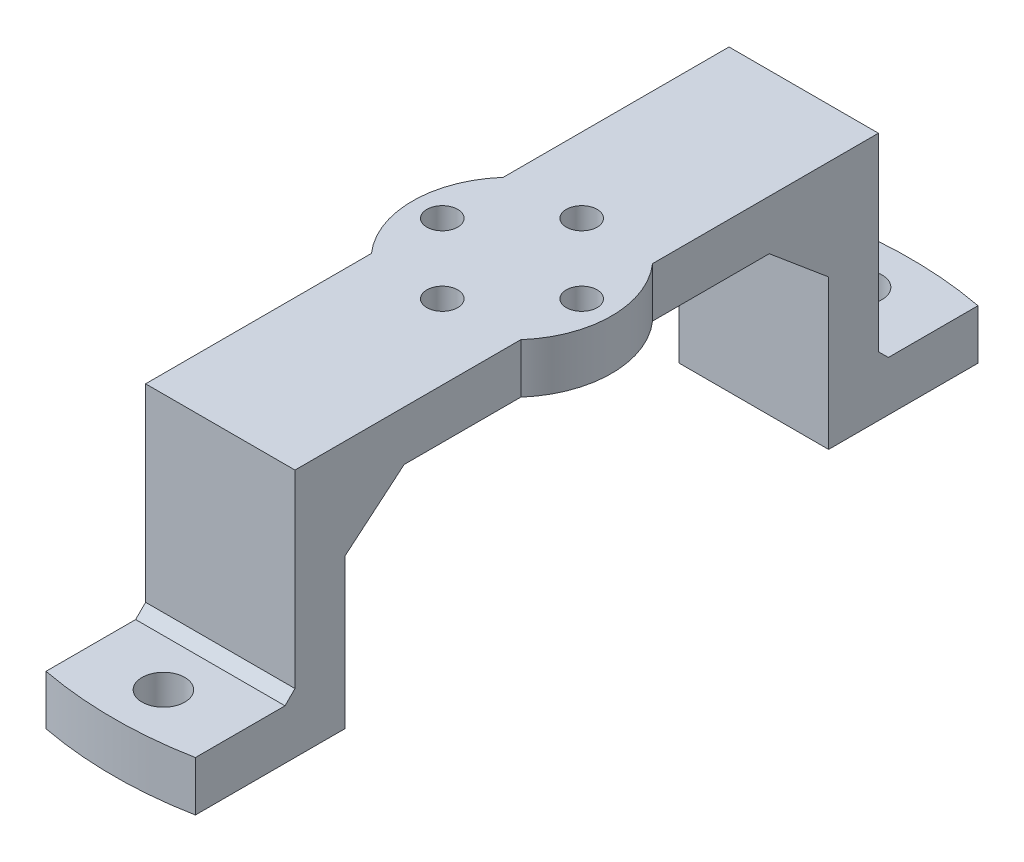
ISO-10303-21;
HEADER;
FILE_DESCRIPTION(('STEP AP214'),'2;1');
FILE_NAME('part.step','',(''),(''),'','','');
FILE_SCHEMA(('AUTOMOTIVE_DESIGN { 1 0 10303 214 1 1 1 1 }'));
ENDSEC;
DATA;
#1=APPLICATION_CONTEXT('core data for automotive mechanical design processes');
#2=APPLICATION_PROTOCOL_DEFINITION('international standard','automotive_design',2000,#1);
#3=PRODUCT_CONTEXT('',#1,'mechanical');
#4=PRODUCT('Part','Part','',(#3));
#5=PRODUCT_RELATED_PRODUCT_CATEGORY('part','',(#4));
#6=PRODUCT_DEFINITION_FORMATION('','',#4);
#7=PRODUCT_DEFINITION_CONTEXT('part definition',#1,'design');
#8=PRODUCT_DEFINITION('design','',#6,#7);
#9=PRODUCT_DEFINITION_SHAPE('','',#8);
#10=(LENGTH_UNIT() NAMED_UNIT(*) SI_UNIT(.MILLI.,.METRE.));
#11=(NAMED_UNIT(*) PLANE_ANGLE_UNIT() SI_UNIT($,.RADIAN.));
#12=(NAMED_UNIT(*) SI_UNIT($,.STERADIAN.) SOLID_ANGLE_UNIT());
#13=UNCERTAINTY_MEASURE_WITH_UNIT(LENGTH_MEASURE(1.E-05),#10,'distance_accuracy_value','');
#14=(GEOMETRIC_REPRESENTATION_CONTEXT(3) GLOBAL_UNCERTAINTY_ASSIGNED_CONTEXT((#13)) GLOBAL_UNIT_ASSIGNED_CONTEXT((#10,
#11,#12)) REPRESENTATION_CONTEXT('',''));
#15=CARTESIAN_POINT('',(0.,0.,0.));
#16=DIRECTION('',(0.,0.,1.));
#17=DIRECTION('',(1.,0.,0.));
#18=AXIS2_PLACEMENT_3D('',#15,#16,#17);
#19=CARTESIAN_POINT('',(7.5,5.,-39.2905841137543));
#20=DIRECTION('',(-1.,0.,0.));
#21=DIRECTION('',(0.,0.,1.));
#22=AXIS2_PLACEMENT_3D('',#19,#20,#21);
#23=PLANE('',#22);
#24=DIRECTION('',(0.,-1.,0.));
#25=VECTOR('',#24,1.);
#26=CARTESIAN_POINT('',(7.5,5.,24.2905841137543));
#27=LINE('',#26,#25);
#28=CARTESIAN_POINT('',(7.5,15.,24.2905841137543));
#29=VERTEX_POINT('',#28);
#30=CARTESIAN_POINT('',(7.5,0.,24.2905841137543));
#31=VERTEX_POINT('',#30);
#32=EDGE_CURVE('E265',#29,#31,#27,.T.);
#33=ORIENTED_EDGE('',*,*,#32,.F.);
#34=DIRECTION('',(0.,0.642787609686536,-0.766044443118981));
#35=VECTOR('',#34,1.);
#36=CARTESIAN_POINT('',(7.5,42.1758545963466,-8.09633823325997));
#37=LINE('',#36,#35);
#38=CARTESIAN_POINT('',(7.5,20.,18.3318161507832));
#39=VERTEX_POINT('',#38);
#40=EDGE_CURVE('E181',#29,#39,#37,.T.);
#41=ORIENTED_EDGE('',*,*,#40,.T.);
#42=DIRECTION('',(0.,0.,-1.));
#43=VECTOR('',#42,1.);
#44=CARTESIAN_POINT('',(7.5,20.,29.2905841137543));
#45=LINE('',#44,#43);
#46=CARTESIAN_POINT('',(7.5,20.,6.61437827766148));
#47=VERTEX_POINT('',#46);
#48=EDGE_CURVE('E174',#39,#47,#45,.T.);
#49=ORIENTED_EDGE('',*,*,#48,.T.);
#50=DIRECTION('',(0.,1.,0.));
#51=VECTOR('',#50,1.);
#52=CARTESIAN_POINT('',(7.5,20.,6.61437827766148));
#53=LINE('',#52,#51);
#54=CARTESIAN_POINT('',(7.5,25.,6.61437827766148));
#55=VERTEX_POINT('',#54);
#56=EDGE_CURVE('E178',#47,#55,#53,.T.);
#57=ORIENTED_EDGE('',*,*,#56,.T.);
#58=DIRECTION('',(0.,0.,-1.));
#59=VECTOR('',#58,1.);
#60=CARTESIAN_POINT('',(7.5,25.,29.2905841137543));
#61=LINE('',#60,#59);
#62=CARTESIAN_POINT('',(7.5,25.,29.2905841137543));
#63=VERTEX_POINT('',#62);
#64=EDGE_CURVE('E281',#63,#55,#61,.T.);
#65=ORIENTED_EDGE('',*,*,#64,.F.);
#66=DIRECTION('',(0.,-1.,0.));
#67=VECTOR('',#66,1.);
#68=CARTESIAN_POINT('',(7.5,25.,29.2905841137543));
#69=LINE('',#68,#67);
#70=CARTESIAN_POINT('',(7.5,6.00000000000002,29.2905841137543));
#71=VERTEX_POINT('',#70);
#72=EDGE_CURVE('E288',#63,#71,#69,.T.);
#73=ORIENTED_EDGE('',*,*,#72,.T.);
#74=DIRECTION('',(0.,-0.707106781186553,0.707106781186542));
#75=VECTOR('',#74,1.);
#76=CARTESIAN_POINT('',(7.5,39.7905841137543,-4.49999999999949));
#77=LINE('',#76,#75);
#78=CARTESIAN_POINT('',(7.5,5.,30.2905841137543));
#79=VERTEX_POINT('',#78);
#80=EDGE_CURVE('E48',#71,#79,#77,.T.);
#81=ORIENTED_EDGE('',*,*,#80,.T.);
#82=DIRECTION('',(0.,0.,-1.));
#83=VECTOR('',#82,1.);
#84=CARTESIAN_POINT('',(7.5,5.,24.2905841137543));
#85=LINE('',#84,#83);
#86=CARTESIAN_POINT('',(7.5,5.,39.2905841137543));
#87=VERTEX_POINT('',#86);
#88=EDGE_CURVE('E238',#87,#79,#85,.T.);
#89=ORIENTED_EDGE('',*,*,#88,.F.);
#90=DIRECTION('',(0.,-1.,0.));
#91=VECTOR('',#90,1.);
#92=CARTESIAN_POINT('',(7.5,5.,39.2905841137543));
#93=LINE('',#92,#91);
#94=CARTESIAN_POINT('',(7.5,0.,39.2905841137543));
#95=VERTEX_POINT('',#94);
#96=EDGE_CURVE('E268',#87,#95,#93,.T.);
#97=ORIENTED_EDGE('',*,*,#96,.T.);
#98=DIRECTION('',(0.,0.,-1.));
#99=VECTOR('',#98,1.);
#100=CARTESIAN_POINT('',(7.5,0.,24.2905841137543));
#101=LINE('',#100,#99);
#102=EDGE_CURVE('E249',#95,#31,#101,.T.);
#103=ORIENTED_EDGE('',*,*,#102,.T.);
#104=EDGE_LOOP('',(#33,#41,#49,#57,#65,#73,#81,#89,#97,#103));
#105=FACE_BOUND('',#104,.T.);
#106=ADVANCED_FACE('F39',(#105),#23,.F.);
#107=CARTESIAN_POINT('',(-7.5,5.,-39.2905841137543));
#108=DIRECTION('',(1.,0.,0.));
#109=DIRECTION('',(0.,0.,-1.));
#110=AXIS2_PLACEMENT_3D('',#107,#108,#109);
#111=PLANE('',#110);
#112=DIRECTION('',(0.,-1.,0.));
#113=VECTOR('',#112,1.);
#114=CARTESIAN_POINT('',(-7.5,5.,-24.2905841137543));
#115=LINE('',#114,#113);
#116=CARTESIAN_POINT('',(-7.5,15.,-24.2905841137543));
#117=VERTEX_POINT('',#116);
#118=CARTESIAN_POINT('',(-7.5,0.,-24.2905841137543));
#119=VERTEX_POINT('',#118);
#120=EDGE_CURVE('E326',#117,#119,#115,.T.);
#121=ORIENTED_EDGE('',*,*,#120,.F.);
#122=DIRECTION('',(0.,0.642787609686536,0.766044443118981));
#123=VECTOR('',#122,1.);
#124=CARTESIAN_POINT('',(-7.5,3.48218274074315,-38.0169842113174));
#125=LINE('',#124,#123);
#126=CARTESIAN_POINT('',(-7.5,20.,-18.3318161507832));
#127=VERTEX_POINT('',#126);
#128=EDGE_CURVE('E367',#117,#127,#125,.T.);
#129=ORIENTED_EDGE('',*,*,#128,.T.);
#130=DIRECTION('',(0.,0.,1.));
#131=VECTOR('',#130,1.);
#132=CARTESIAN_POINT('',(-7.5,20.,29.2905841137543));
#133=LINE('',#132,#131);
#134=CARTESIAN_POINT('',(-7.5,20.,-6.61437827766147));
#135=VERTEX_POINT('',#134);
#136=EDGE_CURVE('E289',#127,#135,#133,.T.);
#137=ORIENTED_EDGE('',*,*,#136,.T.);
#138=DIRECTION('',(0.,1.,0.));
#139=VECTOR('',#138,1.);
#140=CARTESIAN_POINT('',(-7.5,20.,-6.61437827766147));
#141=LINE('',#140,#139);
#142=CARTESIAN_POINT('',(-7.5,25.,-6.61437827766148));
#143=VERTEX_POINT('',#142);
#144=EDGE_CURVE('E212',#135,#143,#141,.T.);
#145=ORIENTED_EDGE('',*,*,#144,.T.);
#146=DIRECTION('',(0.,0.,1.));
#147=VECTOR('',#146,1.);
#148=CARTESIAN_POINT('',(-7.5,25.,29.2905841137543));
#149=LINE('',#148,#147);
#150=CARTESIAN_POINT('',(-7.5,25.,-29.2905841137543));
#151=VERTEX_POINT('',#150);
#152=EDGE_CURVE('E273',#151,#143,#149,.T.);
#153=ORIENTED_EDGE('',*,*,#152,.F.);
#154=DIRECTION('',(0.,-1.,0.));
#155=VECTOR('',#154,1.);
#156=CARTESIAN_POINT('',(-7.5,20.,-29.2905841137543));
#157=LINE('',#156,#155);
#158=CARTESIAN_POINT('',(-7.5,6.00000000000002,-29.2905841137543));
#159=VERTEX_POINT('',#158);
#160=EDGE_CURVE('E298',#151,#159,#157,.T.);
#161=ORIENTED_EDGE('',*,*,#160,.T.);
#162=DIRECTION('',(0.,-0.707106781186553,-0.707106781186542));
#163=VECTOR('',#162,1.);
#164=CARTESIAN_POINT('',(-7.5,0.499999999999998,-34.7905841137542));
#165=LINE('',#164,#163);
#166=CARTESIAN_POINT('',(-7.5,5.,-30.2905841137543));
#167=VERTEX_POINT('',#166);
#168=EDGE_CURVE('E388',#159,#167,#165,.T.);
#169=ORIENTED_EDGE('',*,*,#168,.T.);
#170=DIRECTION('',(0.,0.,1.));
#171=VECTOR('',#170,1.);
#172=CARTESIAN_POINT('',(-7.5,5.,-39.2905841137543));
#173=LINE('',#172,#171);
#174=CARTESIAN_POINT('',(-7.49999999999998,5.,-39.2905841137543));
#175=VERTEX_POINT('',#174);
#176=EDGE_CURVE('E322',#175,#167,#173,.T.);
#177=ORIENTED_EDGE('',*,*,#176,.F.);
#178=DIRECTION('',(0.,-1.,0.));
#179=VECTOR('',#178,1.);
#180=CARTESIAN_POINT('',(-7.49999999999998,5.,-39.2905841137543));
#181=LINE('',#180,#179);
#182=CARTESIAN_POINT('',(-7.49999999999998,0.,-39.2905841137543));
#183=VERTEX_POINT('',#182);
#184=EDGE_CURVE('E341',#175,#183,#181,.T.);
#185=ORIENTED_EDGE('',*,*,#184,.T.);
#186=DIRECTION('',(0.,0.,1.));
#187=VECTOR('',#186,1.);
#188=CARTESIAN_POINT('',(-7.5,0.,-39.2905841137543));
#189=LINE('',#188,#187);
#190=EDGE_CURVE('E319',#183,#119,#189,.T.);
#191=ORIENTED_EDGE('',*,*,#190,.T.);
#192=EDGE_LOOP('',(#121,#129,#137,#145,#153,#161,#169,#177,#185,#191));
#193=FACE_BOUND('',#192,.T.);
#194=ADVANCED_FACE('F442',(#193),#111,.F.);
#195=CARTESIAN_POINT('',(0.,20.,0.));
#196=DIRECTION('',(0.,-1.,0.));
#197=DIRECTION('',(0.,0.,-1.));
#198=AXIS2_PLACEMENT_3D('',#195,#196,#197);
#199=PLANE('',#198);
#200=CARTESIAN_POINT('',(0.,20.,-7.));
#201=DIRECTION('',(0.,1.,0.));
#202=DIRECTION('',(0.,0.,1.));
#203=AXIS2_PLACEMENT_3D('',#200,#201,#202);
#204=CIRCLE('',#203,1.55);
#205=CARTESIAN_POINT('',(0.,20.,-5.45));
#206=VERTEX_POINT('',#205);
#207=EDGE_CURVE('E438',#206,#206,#204,.T.);
#208=ORIENTED_EDGE('',*,*,#207,.T.);
#209=EDGE_LOOP('',(#208));
#210=FACE_BOUND('',#209,.T.);
#211=CARTESIAN_POINT('',(7.,20.,0.));
#212=DIRECTION('',(0.,1.,0.));
#213=DIRECTION('',(0.,0.,1.));
#214=AXIS2_PLACEMENT_3D('',#211,#212,#213);
#215=CIRCLE('',#214,1.55);
#216=CARTESIAN_POINT('',(7.,20.,1.55));
#217=VERTEX_POINT('',#216);
#218=EDGE_CURVE('E802',#217,#217,#215,.T.);
#219=ORIENTED_EDGE('',*,*,#218,.T.);
#220=EDGE_LOOP('',(#219));
#221=FACE_BOUND('',#220,.T.);
#222=CARTESIAN_POINT('',(0.,20.,7.));
#223=DIRECTION('',(0.,1.,0.));
#224=DIRECTION('',(0.,0.,1.));
#225=AXIS2_PLACEMENT_3D('',#222,#223,#224);
#226=CIRCLE('',#225,1.55);
#227=CARTESIAN_POINT('',(0.,20.,8.55));
#228=VERTEX_POINT('',#227);
#229=EDGE_CURVE('E794',#228,#228,#226,.T.);
#230=ORIENTED_EDGE('',*,*,#229,.T.);
#231=EDGE_LOOP('',(#230));
#232=FACE_BOUND('',#231,.T.);
#233=CARTESIAN_POINT('',(-7.,20.,0.));
#234=DIRECTION('',(0.,1.,0.));
#235=DIRECTION('',(0.,0.,1.));
#236=AXIS2_PLACEMENT_3D('',#233,#234,#235);
#237=CIRCLE('',#236,1.55);
#238=CARTESIAN_POINT('',(-7.,20.,1.55));
#239=VERTEX_POINT('',#238);
#240=EDGE_CURVE('E788',#239,#239,#237,.T.);
#241=ORIENTED_EDGE('',*,*,#240,.T.);
#242=EDGE_LOOP('',(#241));
#243=FACE_BOUND('',#242,.T.);
#244=ORIENTED_EDGE('',*,*,#136,.F.);
#245=DIRECTION('',(1.,0.,0.));
#246=VECTOR('',#245,1.);
#247=CARTESIAN_POINT('',(0.,20.,-18.3318161507832));
#248=LINE('',#247,#246);
#249=CARTESIAN_POINT('',(7.5,20.,-18.3318161507832));
#250=VERTEX_POINT('',#249);
#251=EDGE_CURVE('E355',#127,#250,#248,.T.);
#252=ORIENTED_EDGE('',*,*,#251,.T.);
#253=CARTESIAN_POINT('',(7.5,20.,-6.61437827766148));
#254=VERTEX_POINT('',#253);
#255=EDGE_CURVE('E188',#254,#250,#45,.T.);
#256=ORIENTED_EDGE('',*,*,#255,.F.);
#257=CARTESIAN_POINT('',(0.,20.,0.));
#258=DIRECTION('',(0.,1.,0.));
#259=DIRECTION('',(0.,0.,1.));
#260=AXIS2_PLACEMENT_3D('',#257,#258,#259);
#261=CIRCLE('',#260,10.);
#262=EDGE_CURVE('E193',#47,#254,#261,.T.);
#263=ORIENTED_EDGE('',*,*,#262,.F.);
#264=ORIENTED_EDGE('',*,*,#48,.F.);
#265=DIRECTION('',(-1.,0.,0.));
#266=VECTOR('',#265,1.);
#267=CARTESIAN_POINT('',(0.,20.,18.3318161507832));
#268=LINE('',#267,#266);
#269=CARTESIAN_POINT('',(-7.5,20.,18.3318161507832));
#270=VERTEX_POINT('',#269);
#271=EDGE_CURVE('E352',#39,#270,#268,.T.);
#272=ORIENTED_EDGE('',*,*,#271,.T.);
#273=CARTESIAN_POINT('',(-7.5,20.,6.61437827766147));
#274=VERTEX_POINT('',#273);
#275=EDGE_CURVE('E272',#274,#270,#133,.T.);
#276=ORIENTED_EDGE('',*,*,#275,.F.);
#277=EDGE_CURVE('E207',#135,#274,#261,.T.);
#278=ORIENTED_EDGE('',*,*,#277,.F.);
#279=EDGE_LOOP('',(#244,#252,#256,#263,#264,#272,#276,#278));
#280=FACE_BOUND('',#279,.T.);
#281=ADVANCED_FACE('F202',(#210,#221,#232,#243,#280),#199,.T.);
#282=CARTESIAN_POINT('',(0.,5.,0.));
#283=DIRECTION('',(0.,1.,0.));
#284=DIRECTION('',(0.,0.,1.));
#285=AXIS2_PLACEMENT_3D('',#282,#283,#284);
#286=PLANE('',#285);
#287=ORIENTED_EDGE('',*,*,#176,.T.);
#288=DIRECTION('',(1.,0.,0.));
#289=VECTOR('',#288,1.);
#290=CARTESIAN_POINT('',(0.,5.,-30.2905841137543));
#291=LINE('',#290,#289);
#292=CARTESIAN_POINT('',(7.5,5.,-30.2905841137543));
#293=VERTEX_POINT('',#292);
#294=EDGE_CURVE('E379',#167,#293,#291,.T.);
#295=ORIENTED_EDGE('',*,*,#294,.T.);
#296=DIRECTION('',(0.,0.,-1.));
#297=VECTOR('',#296,1.);
#298=CARTESIAN_POINT('',(7.5,5.,-39.2905841137543));
#299=LINE('',#298,#297);
#300=CARTESIAN_POINT('',(7.5,5.,-39.2905841137543));
#301=VERTEX_POINT('',#300);
#302=EDGE_CURVE('E315',#293,#301,#299,.T.);
#303=ORIENTED_EDGE('',*,*,#302,.T.);
#304=CARTESIAN_POINT('',(0.,5.,0.));
#305=DIRECTION('',(0.,1.,0.));
#306=DIRECTION('',(0.,0.,1.));
#307=AXIS2_PLACEMENT_3D('',#304,#305,#306);
#308=CIRCLE('',#307,40.);
#309=EDGE_CURVE('E318',#301,#175,#308,.T.);
#310=ORIENTED_EDGE('',*,*,#309,.T.);
#311=EDGE_LOOP('',(#287,#295,#303,#310));
#312=FACE_BOUND('',#311,.T.);
#313=CARTESIAN_POINT('',(0.,5.,-35.));
#314=DIRECTION('',(0.,1.,0.));
#315=DIRECTION('',(0.,0.,1.));
#316=AXIS2_PLACEMENT_3D('',#313,#314,#315);
#317=CIRCLE('',#316,2.15);
#318=CARTESIAN_POINT('',(0.,5.,-32.85));
#319=VERTEX_POINT('',#318);
#320=EDGE_CURVE('E307',#319,#319,#317,.T.);
#321=ORIENTED_EDGE('',*,*,#320,.F.);
#322=EDGE_LOOP('',(#321));
#323=FACE_BOUND('',#322,.T.);
#324=ADVANCED_FACE('F469',(#312,#323),#286,.T.);
#325=CARTESIAN_POINT('',(0.,0.,0.));
#326=DIRECTION('',(0.,1.,0.));
#327=DIRECTION('',(0.,0.,1.));
#328=AXIS2_PLACEMENT_3D('',#325,#326,#327);
#329=PLANE('',#328);
#330=DIRECTION('',(1.,0.,0.));
#331=VECTOR('',#330,1.);
#332=CARTESIAN_POINT('',(-7.5,0.,-24.2905841137543));
#333=LINE('',#332,#331);
#334=CARTESIAN_POINT('',(7.5,0.,-24.2905841137543));
#335=VERTEX_POINT('',#334);
#336=EDGE_CURVE('E311',#119,#335,#333,.T.);
#337=ORIENTED_EDGE('',*,*,#336,.F.);
#338=ORIENTED_EDGE('',*,*,#190,.F.);
#339=CARTESIAN_POINT('',(0.,0.,0.));
#340=DIRECTION('',(0.,1.,0.));
#341=DIRECTION('',(0.,0.,1.));
#342=AXIS2_PLACEMENT_3D('',#339,#340,#341);
#343=CIRCLE('',#342,40.);
#344=CARTESIAN_POINT('',(7.5,0.,-39.2905841137543));
#345=VERTEX_POINT('',#344);
#346=EDGE_CURVE('E333',#345,#183,#343,.T.);
#347=ORIENTED_EDGE('',*,*,#346,.F.);
#348=DIRECTION('',(0.,0.,-1.));
#349=VECTOR('',#348,1.);
#350=CARTESIAN_POINT('',(7.5,0.,-39.2905841137543));
#351=LINE('',#350,#349);
#352=EDGE_CURVE('E330',#335,#345,#351,.T.);
#353=ORIENTED_EDGE('',*,*,#352,.F.);
#354=EDGE_LOOP('',(#337,#338,#347,#353));
#355=FACE_BOUND('',#354,.T.);
#356=CARTESIAN_POINT('',(0.,0.,-35.));
#357=DIRECTION('',(0.,1.,0.));
#358=DIRECTION('',(0.,0.,1.));
#359=AXIS2_PLACEMENT_3D('',#356,#357,#358);
#360=CIRCLE('',#359,2.15);
#361=CARTESIAN_POINT('',(0.,0.,-32.85));
#362=VERTEX_POINT('',#361);
#363=EDGE_CURVE('E306',#362,#362,#360,.T.);
#364=ORIENTED_EDGE('',*,*,#363,.T.);
#365=EDGE_LOOP('',(#364));
#366=FACE_BOUND('',#365,.T.);
#367=ADVANCED_FACE('F458',(#355,#366),#329,.F.);
#368=CARTESIAN_POINT('',(-7.5,5.,-24.2905841137543));
#369=DIRECTION('',(0.,0.,-1.));
#370=DIRECTION('',(-1.,0.,0.));
#371=AXIS2_PLACEMENT_3D('',#368,#369,#370);
#372=PLANE('',#371);
#373=DIRECTION('',(0.,-1.,0.));
#374=VECTOR('',#373,1.);
#375=CARTESIAN_POINT('',(7.5,5.,-24.2905841137543));
#376=LINE('',#375,#374);
#377=CARTESIAN_POINT('',(7.5,15.,-24.2905841137543));
#378=VERTEX_POINT('',#377);
#379=EDGE_CURVE('E349',#378,#335,#376,.T.);
#380=ORIENTED_EDGE('',*,*,#379,.F.);
#381=DIRECTION('',(-1.,0.,0.));
#382=VECTOR('',#381,1.);
#383=CARTESIAN_POINT('',(-7.5,15.,-24.2905841137543));
#384=LINE('',#383,#382);
#385=EDGE_CURVE('E358',#378,#117,#384,.T.);
#386=ORIENTED_EDGE('',*,*,#385,.T.);
#387=ORIENTED_EDGE('',*,*,#120,.T.);
#388=ORIENTED_EDGE('',*,*,#336,.T.);
#389=EDGE_LOOP('',(#380,#386,#387,#388));
#390=FACE_BOUND('',#389,.T.);
#391=ADVANCED_FACE('F454',(#390),#372,.F.);
#392=CARTESIAN_POINT('',(7.5,25.,-6.61437827766148));
#393=VERTEX_POINT('',#392);
#394=CARTESIAN_POINT('',(7.5,25.,-29.2905841137543));
#395=VERTEX_POINT('',#394);
#396=EDGE_CURVE('E280',#393,#395,#61,.T.);
#397=ORIENTED_EDGE('',*,*,#396,.F.);
#398=DIRECTION('',(0.,1.,0.));
#399=VECTOR('',#398,1.);
#400=CARTESIAN_POINT('',(7.5,20.,-6.61437827766148));
#401=LINE('',#400,#399);
#402=EDGE_CURVE('E198',#393,#254,#401,.F.);
#403=ORIENTED_EDGE('',*,*,#402,.T.);
#404=ORIENTED_EDGE('',*,*,#255,.T.);
#405=DIRECTION('',(0.,-0.642787609686536,-0.766044443118981));
#406=VECTOR('',#405,1.);
#407=CARTESIAN_POINT('',(7.5,3.48218274074315,-38.0169842113174));
#408=LINE('',#407,#406);
#409=EDGE_CURVE('E364',#250,#378,#408,.T.);
#410=ORIENTED_EDGE('',*,*,#409,.T.);
#411=ORIENTED_EDGE('',*,*,#379,.T.);
#412=ORIENTED_EDGE('',*,*,#352,.T.);
#413=DIRECTION('',(0.,-1.,0.));
#414=VECTOR('',#413,1.);
#415=CARTESIAN_POINT('',(7.5,5.,-39.2905841137543));
#416=LINE('',#415,#414);
#417=EDGE_CURVE('E345',#301,#345,#416,.T.);
#418=ORIENTED_EDGE('',*,*,#417,.F.);
#419=ORIENTED_EDGE('',*,*,#302,.F.);
#420=DIRECTION('',(0.,0.707106781186553,0.707106781186542));
#421=VECTOR('',#420,1.);
#422=CARTESIAN_POINT('',(7.5,0.499999999999998,-34.7905841137542));
#423=LINE('',#422,#421);
#424=CARTESIAN_POINT('',(7.5,6.00000000000002,-29.2905841137543));
#425=VERTEX_POINT('',#424);
#426=EDGE_CURVE('E391',#293,#425,#423,.T.);
#427=ORIENTED_EDGE('',*,*,#426,.T.);
#428=DIRECTION('',(0.,-1.,0.));
#429=VECTOR('',#428,1.);
#430=CARTESIAN_POINT('',(7.5,20.,-29.2905841137543));
#431=LINE('',#430,#429);
#432=EDGE_CURVE('E302',#395,#425,#431,.T.);
#433=ORIENTED_EDGE('',*,*,#432,.F.);
#434=EDGE_LOOP('',(#397,#403,#404,#410,#411,#412,#418,#419,#427,#433));
#435=FACE_BOUND('',#434,.T.);
#436=ADVANCED_FACE('F451',(#435),#23,.F.);
#437=CARTESIAN_POINT('',(0.,5.,0.));
#438=DIRECTION('',(0.,-1.,0.));
#439=DIRECTION('',(0.,0.,-1.));
#440=AXIS2_PLACEMENT_3D('',#437,#438,#439);
#441=CYLINDRICAL_SURFACE('',#440,40.);
#442=ORIENTED_EDGE('',*,*,#346,.T.);
#443=ORIENTED_EDGE('',*,*,#184,.F.);
#444=ORIENTED_EDGE('',*,*,#309,.F.);
#445=ORIENTED_EDGE('',*,*,#417,.T.);
#446=EDGE_LOOP('',(#442,#443,#444,#445));
#447=FACE_BOUND('',#446,.T.);
#448=ADVANCED_FACE('F465',(#447),#441,.T.);
#449=CARTESIAN_POINT('',(-7.5,25.,6.61437827766148));
#450=VERTEX_POINT('',#449);
#451=CARTESIAN_POINT('',(-7.5,25.,29.2905841137543));
#452=VERTEX_POINT('',#451);
#453=EDGE_CURVE('E187',#450,#452,#149,.T.);
#454=ORIENTED_EDGE('',*,*,#453,.F.);
#455=DIRECTION('',(0.,1.,0.));
#456=VECTOR('',#455,1.);
#457=CARTESIAN_POINT('',(-7.5,20.,6.61437827766147));
#458=LINE('',#457,#456);
#459=EDGE_CURVE('E206',#450,#274,#458,.F.);
#460=ORIENTED_EDGE('',*,*,#459,.T.);
#461=ORIENTED_EDGE('',*,*,#275,.T.);
#462=DIRECTION('',(0.,-0.642787609686536,0.766044443118981));
#463=VECTOR('',#462,1.);
#464=CARTESIAN_POINT('',(-7.5,42.1758545963466,-8.09633823325997));
#465=LINE('',#464,#463);
#466=CARTESIAN_POINT('',(-7.5,15.,24.2905841137543));
#467=VERTEX_POINT('',#466);
#468=EDGE_CURVE('E370',#270,#467,#465,.T.);
#469=ORIENTED_EDGE('',*,*,#468,.T.);
#470=DIRECTION('',(0.,-1.,0.));
#471=VECTOR('',#470,1.);
#472=CARTESIAN_POINT('',(-7.5,5.,24.2905841137543));
#473=LINE('',#472,#471);
#474=CARTESIAN_POINT('',(-7.5,0.,24.2905841137543));
#475=VERTEX_POINT('',#474);
#476=EDGE_CURVE('E262',#467,#475,#473,.T.);
#477=ORIENTED_EDGE('',*,*,#476,.T.);
#478=DIRECTION('',(0.,0.,1.));
#479=VECTOR('',#478,1.);
#480=CARTESIAN_POINT('',(-7.5,0.,24.2905841137543));
#481=LINE('',#480,#479);
#482=CARTESIAN_POINT('',(-7.5,0.,39.2905841137543));
#483=VERTEX_POINT('',#482);
#484=EDGE_CURVE('E239',#475,#483,#481,.T.);
#485=ORIENTED_EDGE('',*,*,#484,.T.);
#486=DIRECTION('',(0.,-1.,0.));
#487=VECTOR('',#486,1.);
#488=CARTESIAN_POINT('',(-7.5,5.,39.2905841137543));
#489=LINE('',#488,#487);
#490=CARTESIAN_POINT('',(-7.5,5.,39.2905841137543));
#491=VERTEX_POINT('',#490);
#492=EDGE_CURVE('E245',#491,#483,#489,.T.);
#493=ORIENTED_EDGE('',*,*,#492,.F.);
#494=DIRECTION('',(0.,0.,1.));
#495=VECTOR('',#494,1.);
#496=CARTESIAN_POINT('',(-7.5,5.,24.2905841137543));
#497=LINE('',#496,#495);
#498=CARTESIAN_POINT('',(-7.5,5.,30.2905841137543));
#499=VERTEX_POINT('',#498);
#500=EDGE_CURVE('E242',#499,#491,#497,.T.);
#501=ORIENTED_EDGE('',*,*,#500,.F.);
#502=DIRECTION('',(0.,0.707106781186553,-0.707106781186542));
#503=VECTOR('',#502,1.);
#504=CARTESIAN_POINT('',(-7.5,39.7905841137543,-4.49999999999949));
#505=LINE('',#504,#503);
#506=CARTESIAN_POINT('',(-7.5,6.00000000000002,29.2905841137543));
#507=VERTEX_POINT('',#506);
#508=EDGE_CURVE('E11',#499,#507,#505,.T.);
#509=ORIENTED_EDGE('',*,*,#508,.T.);
#510=DIRECTION('',(0.,-1.,0.));
#511=VECTOR('',#510,1.);
#512=CARTESIAN_POINT('',(-7.5,25.,29.2905841137543));
#513=LINE('',#512,#511);
#514=EDGE_CURVE('E294',#452,#507,#513,.T.);
#515=ORIENTED_EDGE('',*,*,#514,.F.);
#516=EDGE_LOOP('',(#454,#460,#461,#469,#477,#485,#493,#501,#509,#515));
#517=FACE_BOUND('',#516,.T.);
#518=ADVANCED_FACE('F402',(#517),#111,.F.);
#519=CARTESIAN_POINT('',(0.,5.,-35.));
#520=DIRECTION('',(0.,-1.,0.));
#521=DIRECTION('',(0.,0.,-1.));
#522=AXIS2_PLACEMENT_3D('',#519,#520,#521);
#523=CYLINDRICAL_SURFACE('',#522,2.15);
#524=ORIENTED_EDGE('',*,*,#320,.T.);
#525=EDGE_LOOP('',(#524));
#526=FACE_BOUND('',#525,.T.);
#527=ORIENTED_EDGE('',*,*,#363,.F.);
#528=EDGE_LOOP('',(#527));
#529=FACE_BOUND('',#528,.T.);
#530=ADVANCED_FACE('F481',(#526,#529),#523,.F.);
#531=CARTESIAN_POINT('',(-7.5,20.,-29.2905841137543));
#532=DIRECTION('',(0.,0.,1.));
#533=DIRECTION('',(1.,0.,0.));
#534=AXIS2_PLACEMENT_3D('',#531,#532,#533);
#535=PLANE('',#534);
#536=ORIENTED_EDGE('',*,*,#432,.T.);
#537=DIRECTION('',(-1.,0.,0.));
#538=VECTOR('',#537,1.);
#539=CARTESIAN_POINT('',(-7.5,6.00000000000002,-29.2905841137543));
#540=LINE('',#539,#538);
#541=EDGE_CURVE('E375',#425,#159,#540,.T.);
#542=ORIENTED_EDGE('',*,*,#541,.T.);
#543=ORIENTED_EDGE('',*,*,#160,.F.);
#544=DIRECTION('',(-1.,0.,0.));
#545=VECTOR('',#544,1.);
#546=CARTESIAN_POINT('',(-7.5,25.,-29.2905841137543));
#547=LINE('',#546,#545);
#548=EDGE_CURVE('E284',#395,#151,#547,.T.);
#549=ORIENTED_EDGE('',*,*,#548,.F.);
#550=EDGE_LOOP('',(#536,#542,#543,#549));
#551=FACE_BOUND('',#550,.T.);
#552=ADVANCED_FACE('F478',(#551),#535,.F.);
#553=CARTESIAN_POINT('',(-7.5,25.,29.2905841137543));
#554=DIRECTION('',(0.,0.,-1.));
#555=DIRECTION('',(-1.,0.,0.));
#556=AXIS2_PLACEMENT_3D('',#553,#554,#555);
#557=PLANE('',#556);
#558=ORIENTED_EDGE('',*,*,#514,.T.);
#559=DIRECTION('',(1.,0.,0.));
#560=VECTOR('',#559,1.);
#561=CARTESIAN_POINT('',(-7.5,6.00000000000002,29.2905841137543));
#562=LINE('',#561,#560);
#563=EDGE_CURVE('E382',#507,#71,#562,.T.);
#564=ORIENTED_EDGE('',*,*,#563,.T.);
#565=ORIENTED_EDGE('',*,*,#72,.F.);
#566=DIRECTION('',(1.,0.,0.));
#567=VECTOR('',#566,1.);
#568=CARTESIAN_POINT('',(-7.5,25.,29.2905841137543));
#569=LINE('',#568,#567);
#570=EDGE_CURVE('E277',#452,#63,#569,.T.);
#571=ORIENTED_EDGE('',*,*,#570,.F.);
#572=EDGE_LOOP('',(#558,#564,#565,#571));
#573=FACE_BOUND('',#572,.T.);
#574=ADVANCED_FACE('F430',(#573),#557,.F.);
#575=CARTESIAN_POINT('',(0.,25.,0.));
#576=DIRECTION('',(0.,-1.,0.));
#577=DIRECTION('',(0.,0.,-1.));
#578=AXIS2_PLACEMENT_3D('',#575,#576,#577);
#579=PLANE('',#578);
#580=CARTESIAN_POINT('',(0.,25.,-7.));
#581=DIRECTION('',(0.,1.,0.));
#582=DIRECTION('',(0.,0.,1.));
#583=AXIS2_PLACEMENT_3D('',#580,#581,#582);
#584=CIRCLE('',#583,1.55);
#585=CARTESIAN_POINT('',(0.,25.,-5.45));
#586=VERTEX_POINT('',#585);
#587=EDGE_CURVE('E775',#586,#586,#584,.T.);
#588=ORIENTED_EDGE('',*,*,#587,.F.);
#589=EDGE_LOOP('',(#588));
#590=FACE_BOUND('',#589,.T.);
#591=CARTESIAN_POINT('',(7.,25.,0.));
#592=DIRECTION('',(0.,1.,0.));
#593=DIRECTION('',(0.,0.,1.));
#594=AXIS2_PLACEMENT_3D('',#591,#592,#593);
#595=CIRCLE('',#594,1.55);
#596=CARTESIAN_POINT('',(7.,25.,1.55));
#597=VERTEX_POINT('',#596);
#598=EDGE_CURVE('E779',#597,#597,#595,.T.);
#599=ORIENTED_EDGE('',*,*,#598,.F.);
#600=EDGE_LOOP('',(#599));
#601=FACE_BOUND('',#600,.T.);
#602=CARTESIAN_POINT('',(0.,25.,7.));
#603=DIRECTION('',(0.,1.,0.));
#604=DIRECTION('',(0.,0.,1.));
#605=AXIS2_PLACEMENT_3D('',#602,#603,#604);
#606=CIRCLE('',#605,1.55);
#607=CARTESIAN_POINT('',(0.,25.,8.55));
#608=VERTEX_POINT('',#607);
#609=EDGE_CURVE('E783',#608,#608,#606,.T.);
#610=ORIENTED_EDGE('',*,*,#609,.F.);
#611=EDGE_LOOP('',(#610));
#612=FACE_BOUND('',#611,.T.);
#613=CARTESIAN_POINT('',(-7.,25.,0.));
#614=DIRECTION('',(0.,1.,0.));
#615=DIRECTION('',(0.,0.,1.));
#616=AXIS2_PLACEMENT_3D('',#613,#614,#615);
#617=CIRCLE('',#616,1.55);
#618=CARTESIAN_POINT('',(-7.,25.,1.55));
#619=VERTEX_POINT('',#618);
#620=EDGE_CURVE('E216',#619,#619,#617,.T.);
#621=ORIENTED_EDGE('',*,*,#620,.F.);
#622=EDGE_LOOP('',(#621));
#623=FACE_BOUND('',#622,.T.);
#624=ORIENTED_EDGE('',*,*,#152,.T.);
#625=CARTESIAN_POINT('',(0.,25.,0.));
#626=DIRECTION('',(0.,1.,0.));
#627=DIRECTION('',(0.,0.,1.));
#628=AXIS2_PLACEMENT_3D('',#625,#626,#627);
#629=CIRCLE('',#628,10.);
#630=EDGE_CURVE('E219',#143,#450,#629,.T.);
#631=ORIENTED_EDGE('',*,*,#630,.T.);
#632=ORIENTED_EDGE('',*,*,#453,.T.);
#633=ORIENTED_EDGE('',*,*,#570,.T.);
#634=ORIENTED_EDGE('',*,*,#64,.T.);
#635=EDGE_CURVE('E195',#55,#393,#629,.T.);
#636=ORIENTED_EDGE('',*,*,#635,.T.);
#637=ORIENTED_EDGE('',*,*,#396,.T.);
#638=ORIENTED_EDGE('',*,*,#548,.T.);
#639=EDGE_LOOP('',(#624,#631,#632,#633,#634,#636,#637,#638));
#640=FACE_BOUND('',#639,.T.);
#641=ADVANCED_FACE('F433',(#590,#601,#612,#623,#640),#579,.F.);
#642=CARTESIAN_POINT('',(0.,5.,0.));
#643=DIRECTION('',(0.,1.,0.));
#644=DIRECTION('',(0.,0.,1.));
#645=AXIS2_PLACEMENT_3D('',#642,#643,#644);
#646=PLANE('',#645);
#647=ORIENTED_EDGE('',*,*,#88,.T.);
#648=DIRECTION('',(-1.,0.,0.));
#649=VECTOR('',#648,1.);
#650=CARTESIAN_POINT('',(0.,5.,30.2905841137543));
#651=LINE('',#650,#649);
#652=EDGE_CURVE('E61',#79,#499,#651,.T.);
#653=ORIENTED_EDGE('',*,*,#652,.T.);
#654=ORIENTED_EDGE('',*,*,#500,.T.);
#655=CARTESIAN_POINT('',(0.,5.,0.));
#656=DIRECTION('',(0.,1.,0.));
#657=DIRECTION('',(0.,0.,1.));
#658=AXIS2_PLACEMENT_3D('',#655,#656,#657);
#659=CIRCLE('',#658,40.);
#660=EDGE_CURVE('E234',#491,#87,#659,.T.);
#661=ORIENTED_EDGE('',*,*,#660,.T.);
#662=EDGE_LOOP('',(#647,#653,#654,#661));
#663=FACE_BOUND('',#662,.T.);
#664=CARTESIAN_POINT('',(0.,5.,35.));
#665=DIRECTION('',(0.,1.,0.));
#666=DIRECTION('',(0.,0.,1.));
#667=AXIS2_PLACEMENT_3D('',#664,#665,#666);
#668=CIRCLE('',#667,2.15);
#669=CARTESIAN_POINT('',(0.,5.,37.15));
#670=VERTEX_POINT('',#669);
#671=EDGE_CURVE('E226',#670,#670,#668,.T.);
#672=ORIENTED_EDGE('',*,*,#671,.F.);
#673=EDGE_LOOP('',(#672));
#674=FACE_BOUND('',#673,.T.);
#675=ADVANCED_FACE('F422',(#663,#674),#646,.T.);
#676=CARTESIAN_POINT('',(0.,0.,0.));
#677=DIRECTION('',(0.,1.,0.));
#678=DIRECTION('',(0.,0.,1.));
#679=AXIS2_PLACEMENT_3D('',#676,#677,#678);
#680=PLANE('',#679);
#681=CARTESIAN_POINT('',(0.,0.,0.));
#682=DIRECTION('',(0.,1.,0.));
#683=DIRECTION('',(0.,0.,1.));
#684=AXIS2_PLACEMENT_3D('',#681,#682,#683);
#685=CIRCLE('',#684,40.);
#686=EDGE_CURVE('E230',#483,#95,#685,.T.);
#687=ORIENTED_EDGE('',*,*,#686,.F.);
#688=ORIENTED_EDGE('',*,*,#484,.F.);
#689=DIRECTION('',(-1.,0.,0.));
#690=VECTOR('',#689,1.);
#691=CARTESIAN_POINT('',(-7.5,0.,24.2905841137543));
#692=LINE('',#691,#690);
#693=EDGE_CURVE('E253',#31,#475,#692,.T.);
#694=ORIENTED_EDGE('',*,*,#693,.F.);
#695=ORIENTED_EDGE('',*,*,#102,.F.);
#696=EDGE_LOOP('',(#687,#688,#694,#695));
#697=FACE_BOUND('',#696,.T.);
#698=CARTESIAN_POINT('',(0.,0.,35.));
#699=DIRECTION('',(0.,1.,0.));
#700=DIRECTION('',(0.,0.,1.));
#701=AXIS2_PLACEMENT_3D('',#698,#699,#700);
#702=CIRCLE('',#701,2.15);
#703=CARTESIAN_POINT('',(0.,0.,37.15));
#704=VERTEX_POINT('',#703);
#705=EDGE_CURVE('E197',#704,#704,#702,.T.);
#706=ORIENTED_EDGE('',*,*,#705,.T.);
#707=EDGE_LOOP('',(#706));
#708=FACE_BOUND('',#707,.T.);
#709=ADVANCED_FACE('F416',(#697,#708),#680,.F.);
#710=CARTESIAN_POINT('',(0.,5.,0.));
#711=DIRECTION('',(0.,-1.,0.));
#712=DIRECTION('',(0.,0.,-1.));
#713=AXIS2_PLACEMENT_3D('',#710,#711,#712);
#714=CYLINDRICAL_SURFACE('',#713,40.);
#715=ORIENTED_EDGE('',*,*,#686,.T.);
#716=ORIENTED_EDGE('',*,*,#96,.F.);
#717=ORIENTED_EDGE('',*,*,#660,.F.);
#718=ORIENTED_EDGE('',*,*,#492,.T.);
#719=EDGE_LOOP('',(#715,#716,#717,#718));
#720=FACE_BOUND('',#719,.T.);
#721=ADVANCED_FACE('F421',(#720),#714,.T.);
#722=CARTESIAN_POINT('',(-7.5,5.,24.2905841137543));
#723=DIRECTION('',(0.,0.,1.));
#724=DIRECTION('',(1.,0.,0.));
#725=AXIS2_PLACEMENT_3D('',#722,#723,#724);
#726=PLANE('',#725);
#727=ORIENTED_EDGE('',*,*,#476,.F.);
#728=DIRECTION('',(1.,0.,0.));
#729=VECTOR('',#728,1.);
#730=CARTESIAN_POINT('',(-7.5,15.,24.2905841137543));
#731=LINE('',#730,#729);
#732=EDGE_CURVE('E361',#467,#29,#731,.T.);
#733=ORIENTED_EDGE('',*,*,#732,.T.);
#734=ORIENTED_EDGE('',*,*,#32,.T.);
#735=ORIENTED_EDGE('',*,*,#693,.T.);
#736=EDGE_LOOP('',(#727,#733,#734,#735));
#737=FACE_BOUND('',#736,.T.);
#738=ADVANCED_FACE('F410',(#737),#726,.F.);
#739=CARTESIAN_POINT('',(0.,5.,35.));
#740=DIRECTION('',(0.,-1.,0.));
#741=DIRECTION('',(0.,0.,-1.));
#742=AXIS2_PLACEMENT_3D('',#739,#740,#741);
#743=CYLINDRICAL_SURFACE('',#742,2.15);
#744=ORIENTED_EDGE('',*,*,#671,.T.);
#745=EDGE_LOOP('',(#744));
#746=FACE_BOUND('',#745,.T.);
#747=ORIENTED_EDGE('',*,*,#705,.F.);
#748=EDGE_LOOP('',(#747));
#749=FACE_BOUND('',#748,.T.);
#750=ADVANCED_FACE('F606',(#746,#749),#743,.F.);
#751=CARTESIAN_POINT('',(0.,20.,0.));
#752=DIRECTION('',(0.,1.,0.));
#753=DIRECTION('',(0.,0.,1.));
#754=AXIS2_PLACEMENT_3D('',#751,#752,#753);
#755=CYLINDRICAL_SURFACE('',#754,10.);
#756=ORIENTED_EDGE('',*,*,#144,.F.);
#757=ORIENTED_EDGE('',*,*,#277,.T.);
#758=ORIENTED_EDGE('',*,*,#459,.F.);
#759=ORIENTED_EDGE('',*,*,#630,.F.);
#760=EDGE_LOOP('',(#756,#757,#758,#759));
#761=FACE_BOUND('',#760,.T.);
#762=ADVANCED_FACE('F439',(#761),#755,.T.);
#763=ORIENTED_EDGE('',*,*,#56,.F.);
#764=ORIENTED_EDGE('',*,*,#262,.T.);
#765=ORIENTED_EDGE('',*,*,#402,.F.);
#766=ORIENTED_EDGE('',*,*,#635,.F.);
#767=EDGE_LOOP('',(#763,#764,#765,#766));
#768=FACE_BOUND('',#767,.T.);
#769=ADVANCED_FACE('F191',(#768),#755,.T.);
#770=CARTESIAN_POINT('',(-7.,20.,0.));
#771=DIRECTION('',(0.,1.,0.));
#772=DIRECTION('',(0.,0.,1.));
#773=AXIS2_PLACEMENT_3D('',#770,#771,#772);
#774=CYLINDRICAL_SURFACE('',#773,1.55);
#775=ORIENTED_EDGE('',*,*,#240,.F.);
#776=EDGE_LOOP('',(#775));
#777=FACE_BOUND('',#776,.T.);
#778=ORIENTED_EDGE('',*,*,#620,.T.);
#779=EDGE_LOOP('',(#778));
#780=FACE_BOUND('',#779,.T.);
#781=ADVANCED_FACE('F653',(#777,#780),#774,.F.);
#782=CARTESIAN_POINT('',(0.,20.,7.));
#783=DIRECTION('',(0.,1.,0.));
#784=DIRECTION('',(0.,0.,1.));
#785=AXIS2_PLACEMENT_3D('',#782,#783,#784);
#786=CYLINDRICAL_SURFACE('',#785,1.55);
#787=ORIENTED_EDGE('',*,*,#229,.F.);
#788=EDGE_LOOP('',(#787));
#789=FACE_BOUND('',#788,.T.);
#790=ORIENTED_EDGE('',*,*,#609,.T.);
#791=EDGE_LOOP('',(#790));
#792=FACE_BOUND('',#791,.T.);
#793=ADVANCED_FACE('F643',(#789,#792),#786,.F.);
#794=CARTESIAN_POINT('',(7.,20.,0.));
#795=DIRECTION('',(0.,1.,0.));
#796=DIRECTION('',(0.,0.,1.));
#797=AXIS2_PLACEMENT_3D('',#794,#795,#796);
#798=CYLINDRICAL_SURFACE('',#797,1.55);
#799=ORIENTED_EDGE('',*,*,#218,.F.);
#800=EDGE_LOOP('',(#799));
#801=FACE_BOUND('',#800,.T.);
#802=ORIENTED_EDGE('',*,*,#598,.T.);
#803=EDGE_LOOP('',(#802));
#804=FACE_BOUND('',#803,.T.);
#805=ADVANCED_FACE('F633',(#801,#804),#798,.F.);
#806=CARTESIAN_POINT('',(0.,20.,-7.));
#807=DIRECTION('',(0.,1.,0.));
#808=DIRECTION('',(0.,0.,1.));
#809=AXIS2_PLACEMENT_3D('',#806,#807,#808);
#810=CYLINDRICAL_SURFACE('',#809,1.55);
#811=ORIENTED_EDGE('',*,*,#207,.F.);
#812=EDGE_LOOP('',(#811));
#813=FACE_BOUND('',#812,.T.);
#814=ORIENTED_EDGE('',*,*,#587,.T.);
#815=EDGE_LOOP('',(#814));
#816=FACE_BOUND('',#815,.T.);
#817=ADVANCED_FACE('F510',(#813,#816),#810,.F.);
#818=CARTESIAN_POINT('',(0.,20.,-18.3318161507832));
#819=DIRECTION('',(0.,0.766044443118981,-0.642787609686536));
#820=DIRECTION('',(1.,0.,0.));
#821=AXIS2_PLACEMENT_3D('',#818,#819,#820);
#822=PLANE('',#821);
#823=ORIENTED_EDGE('',*,*,#128,.F.);
#824=ORIENTED_EDGE('',*,*,#385,.F.);
#825=ORIENTED_EDGE('',*,*,#409,.F.);
#826=ORIENTED_EDGE('',*,*,#251,.F.);
#827=EDGE_LOOP('',(#823,#824,#825,#826));
#828=FACE_BOUND('',#827,.T.);
#829=ADVANCED_FACE('F446',(#828),#822,.F.);
#830=CARTESIAN_POINT('',(0.,20.,18.3318161507832));
#831=DIRECTION('',(0.,0.766044443118981,0.642787609686536));
#832=DIRECTION('',(-1.,0.,0.));
#833=AXIS2_PLACEMENT_3D('',#830,#831,#832);
#834=PLANE('',#833);
#835=ORIENTED_EDGE('',*,*,#40,.F.);
#836=ORIENTED_EDGE('',*,*,#732,.F.);
#837=ORIENTED_EDGE('',*,*,#468,.F.);
#838=ORIENTED_EDGE('',*,*,#271,.F.);
#839=EDGE_LOOP('',(#835,#836,#837,#838));
#840=FACE_BOUND('',#839,.T.);
#841=ADVANCED_FACE('F407',(#840),#834,.F.);
#842=CARTESIAN_POINT('',(-7.5,6.00000000000002,-29.2905841137543));
#843=DIRECTION('',(0.,-0.707106781186542,0.707106781186553));
#844=DIRECTION('',(-1.,0.,0.));
#845=AXIS2_PLACEMENT_3D('',#842,#843,#844);
#846=PLANE('',#845);
#847=ORIENTED_EDGE('',*,*,#426,.F.);
#848=ORIENTED_EDGE('',*,*,#294,.F.);
#849=ORIENTED_EDGE('',*,*,#168,.F.);
#850=ORIENTED_EDGE('',*,*,#541,.F.);
#851=EDGE_LOOP('',(#847,#848,#849,#850));
#852=FACE_BOUND('',#851,.T.);
#853=ADVANCED_FACE('F476',(#852),#846,.F.);
#854=CARTESIAN_POINT('',(-7.5,6.00000000000002,29.2905841137543));
#855=DIRECTION('',(0.,-0.707106781186542,-0.707106781186553));
#856=DIRECTION('',(1.,0.,0.));
#857=AXIS2_PLACEMENT_3D('',#854,#855,#856);
#858=PLANE('',#857);
#859=ORIENTED_EDGE('',*,*,#508,.F.);
#860=ORIENTED_EDGE('',*,*,#652,.F.);
#861=ORIENTED_EDGE('',*,*,#80,.F.);
#862=ORIENTED_EDGE('',*,*,#563,.F.);
#863=EDGE_LOOP('',(#859,#860,#861,#862));
#864=FACE_BOUND('',#863,.T.);
#865=ADVANCED_FACE('F41',(#864),#858,.F.);
#866=CLOSED_SHELL('',(#106,#194,#281,#324,#367,#391,#436,#448,#518,#530,#552,#574,#641,#675,
#709,#721,#738,#750,#762,#769,#781,#793,#805,#817,#829,#841,#853,#865));
#867=MANIFOLD_SOLID_BREP('B2',#866);
#868=ADVANCED_BREP_SHAPE_REPRESENTATION('',(#18,#867),#14);
#869=SHAPE_DEFINITION_REPRESENTATION(#9,#868);
ENDSEC;
END-ISO-10303-21;
